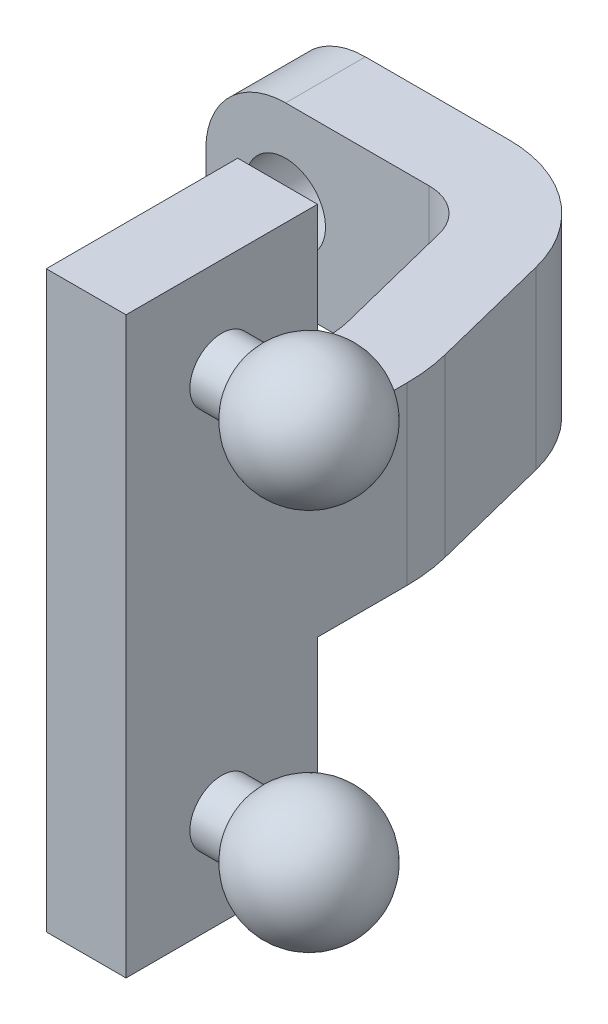
ISO-10303-21;
HEADER;
FILE_DESCRIPTION(('STEP AP214'),'2;1');
FILE_NAME('part.step','',(''),(''),'','','');
FILE_SCHEMA(('AUTOMOTIVE_DESIGN { 1 0 10303 214 1 1 1 1 }'));
ENDSEC;
DATA;
#1=APPLICATION_CONTEXT('core data for automotive mechanical design processes');
#2=APPLICATION_PROTOCOL_DEFINITION('international standard','automotive_design',2000,#1);
#3=PRODUCT_CONTEXT('',#1,'mechanical');
#4=PRODUCT('Part','Part','',(#3));
#5=PRODUCT_RELATED_PRODUCT_CATEGORY('part','',(#4));
#6=PRODUCT_DEFINITION_FORMATION('','',#4);
#7=PRODUCT_DEFINITION_CONTEXT('part definition',#1,'design');
#8=PRODUCT_DEFINITION('design','',#6,#7);
#9=PRODUCT_DEFINITION_SHAPE('','',#8);
#10=(LENGTH_UNIT() NAMED_UNIT(*) SI_UNIT(.MILLI.,.METRE.));
#11=(NAMED_UNIT(*) PLANE_ANGLE_UNIT() SI_UNIT($,.RADIAN.));
#12=(NAMED_UNIT(*) SI_UNIT($,.STERADIAN.) SOLID_ANGLE_UNIT());
#13=UNCERTAINTY_MEASURE_WITH_UNIT(LENGTH_MEASURE(1.E-05),#10,'distance_accuracy_value','');
#14=(GEOMETRIC_REPRESENTATION_CONTEXT(3) GLOBAL_UNCERTAINTY_ASSIGNED_CONTEXT((#13)) GLOBAL_UNIT_ASSIGNED_CONTEXT((#10,
#11,#12)) REPRESENTATION_CONTEXT('',''));
#15=CARTESIAN_POINT('',(0.,0.,0.));
#16=DIRECTION('',(0.,0.,1.));
#17=DIRECTION('',(1.,0.,0.));
#18=AXIS2_PLACEMENT_3D('',#15,#16,#17);
#19=CARTESIAN_POINT('',(0.,2.75,0.));
#20=DIRECTION('',(1.,0.,0.));
#21=DIRECTION('',(0.,0.,-1.));
#22=AXIS2_PLACEMENT_3D('',#19,#20,#21);
#23=PLANE('',#22);
#24=DIRECTION('',(0.,-1.,0.));
#25=VECTOR('',#24,1.);
#26=CARTESIAN_POINT('',(0.,2.75,0.));
#27=LINE('',#26,#25);
#28=CARTESIAN_POINT('',(0.,0.25,0.));
#29=VERTEX_POINT('',#28);
#30=CARTESIAN_POINT('',(0.,-0.25,0.));
#31=VERTEX_POINT('',#30);
#32=EDGE_CURVE('E245',#29,#31,#27,.T.);
#33=ORIENTED_EDGE('',*,*,#32,.T.);
#34=DIRECTION('',(0.,0.,1.));
#35=VECTOR('',#34,1.);
#36=CARTESIAN_POINT('',(0.,-0.25,2.5));
#37=LINE('',#36,#35);
#38=CARTESIAN_POINT('',(0.,-0.25,2.5));
#39=VERTEX_POINT('',#38);
#40=EDGE_CURVE('E296',#31,#39,#37,.T.);
#41=ORIENTED_EDGE('',*,*,#40,.T.);
#42=DIRECTION('',(0.,-1.,0.));
#43=VECTOR('',#42,1.);
#44=CARTESIAN_POINT('',(0.,2.75,2.5));
#45=LINE('',#44,#43);
#46=CARTESIAN_POINT('',(0.,0.25,2.5));
#47=VERTEX_POINT('',#46);
#48=EDGE_CURVE('E291',#47,#39,#45,.T.);
#49=ORIENTED_EDGE('',*,*,#48,.F.);
#50=DIRECTION('',(0.,0.,1.));
#51=VECTOR('',#50,1.);
#52=CARTESIAN_POINT('',(0.,0.25,0.));
#53=LINE('',#52,#51);
#54=EDGE_CURVE('E294',#47,#29,#53,.F.);
#55=ORIENTED_EDGE('',*,*,#54,.T.);
#56=EDGE_LOOP('',(#33,#41,#49,#55));
#57=FACE_BOUND('',#56,.T.);
#58=ADVANCED_FACE('F41',(#57),#23,.F.);
#59=CARTESIAN_POINT('',(0.,2.75,2.5));
#60=DIRECTION('',(0.,0.,-1.));
#61=DIRECTION('',(-1.,0.,0.));
#62=AXIS2_PLACEMENT_3D('',#59,#60,#61);
#63=PLANE('',#62);
#64=CARTESIAN_POINT('',(2.5,0.,2.5));
#65=DIRECTION('',(0.,0.,-1.));
#66=DIRECTION('',(-1.,0.,0.));
#67=AXIS2_PLACEMENT_3D('',#64,#65,#66);
#68=CIRCLE('',#67,1.25);
#69=CARTESIAN_POINT('',(1.25,0.,2.5));
#70=VERTEX_POINT('',#69);
#71=EDGE_CURVE('E220',#70,#70,#68,.T.);
#72=ORIENTED_EDGE('',*,*,#71,.T.);
#73=EDGE_LOOP('',(#72));
#74=FACE_BOUND('',#73,.T.);
#75=ORIENTED_EDGE('',*,*,#48,.T.);
#76=CARTESIAN_POINT('',(2.5,-0.25,2.5));
#77=DIRECTION('',(0.,0.,-1.));
#78=DIRECTION('',(-1.,0.,0.));
#79=AXIS2_PLACEMENT_3D('',#76,#77,#78);
#80=CIRCLE('',#79,2.5);
#81=CARTESIAN_POINT('',(2.5,-2.75,2.5));
#82=VERTEX_POINT('',#81);
#83=EDGE_CURVE('E301',#39,#82,#80,.F.);
#84=ORIENTED_EDGE('',*,*,#83,.T.);
#85=DIRECTION('',(1.,0.,0.));
#86=VECTOR('',#85,1.);
#87=CARTESIAN_POINT('',(0.,-2.75,2.5));
#88=LINE('',#87,#86);
#89=CARTESIAN_POINT('',(7.,-2.75,2.5));
#90=VERTEX_POINT('',#89);
#91=EDGE_CURVE('E223',#82,#90,#88,.T.);
#92=ORIENTED_EDGE('',*,*,#91,.T.);
#93=DIRECTION('',(0.,-1.,0.));
#94=VECTOR('',#93,1.);
#95=CARTESIAN_POINT('',(7.,2.75,2.5));
#96=LINE('',#95,#94);
#97=CARTESIAN_POINT('',(7.,2.75,2.5));
#98=VERTEX_POINT('',#97);
#99=EDGE_CURVE('E288',#98,#90,#96,.T.);
#100=ORIENTED_EDGE('',*,*,#99,.F.);
#101=DIRECTION('',(1.,0.,0.));
#102=VECTOR('',#101,1.);
#103=CARTESIAN_POINT('',(0.,2.75,2.5));
#104=LINE('',#103,#102);
#105=CARTESIAN_POINT('',(2.5,2.75,2.5));
#106=VERTEX_POINT('',#105);
#107=EDGE_CURVE('E224',#106,#98,#104,.T.);
#108=ORIENTED_EDGE('',*,*,#107,.F.);
#109=CARTESIAN_POINT('',(2.5,0.25,2.5));
#110=DIRECTION('',(0.,0.,-1.));
#111=DIRECTION('',(-1.,0.,0.));
#112=AXIS2_PLACEMENT_3D('',#109,#110,#111);
#113=CIRCLE('',#112,2.5);
#114=EDGE_CURVE('E299',#106,#47,#113,.F.);
#115=ORIENTED_EDGE('',*,*,#114,.T.);
#116=EDGE_LOOP('',(#75,#84,#92,#100,#108,#115));
#117=FACE_BOUND('',#116,.T.);
#118=ADVANCED_FACE('F384',(#74,#117),#63,.F.);
#119=CARTESIAN_POINT('',(7.,2.75,4.));
#120=DIRECTION('',(0.,-1.,0.));
#121=DIRECTION('',(0.,0.,-1.));
#122=AXIS2_PLACEMENT_3D('',#119,#120,#121);
#123=CYLINDRICAL_SURFACE('',#122,1.5);
#124=CARTESIAN_POINT('',(7.,-2.75,4.));
#125=DIRECTION('',(0.,-1.,0.));
#126=DIRECTION('',(0.,0.,-1.));
#127=AXIS2_PLACEMENT_3D('',#124,#125,#126);
#128=CIRCLE('',#127,1.5);
#129=CARTESIAN_POINT('',(8.4551584618403,-2.75,3.63597548031131));
#130=VERTEX_POINT('',#129);
#131=EDGE_CURVE('E247',#90,#130,#128,.T.);
#132=ORIENTED_EDGE('',*,*,#131,.T.);
#133=DIRECTION('',(0.,-1.,0.));
#134=VECTOR('',#133,1.);
#135=CARTESIAN_POINT('',(8.4551584618403,2.75,3.63597548031131));
#136=LINE('',#135,#134);
#137=CARTESIAN_POINT('',(8.4551584618403,2.75,3.63597548031131));
#138=VERTEX_POINT('',#137);
#139=EDGE_CURVE('E285',#138,#130,#136,.T.);
#140=ORIENTED_EDGE('',*,*,#139,.F.);
#141=CARTESIAN_POINT('',(7.,2.75,4.));
#142=DIRECTION('',(0.,-1.,0.));
#143=DIRECTION('',(0.,0.,-1.));
#144=AXIS2_PLACEMENT_3D('',#141,#142,#143);
#145=CIRCLE('',#144,1.5);
#146=EDGE_CURVE('E226',#98,#138,#145,.T.);
#147=ORIENTED_EDGE('',*,*,#146,.F.);
#148=ORIENTED_EDGE('',*,*,#99,.T.);
#149=EDGE_LOOP('',(#132,#140,#147,#148));
#150=FACE_BOUND('',#149,.T.);
#151=ADVANCED_FACE('F347',(#150),#123,.F.);
#152=CARTESIAN_POINT('',(8.4551584618403,2.75,3.63597548031131));
#153=DIRECTION('',(0.970105641226864,0.,-0.242683013125794));
#154=DIRECTION('',(-0.242683013125794,0.,-0.970105641226864));
#155=AXIS2_PLACEMENT_3D('',#152,#153,#154);
#156=PLANE('',#155);
#157=DIRECTION('',(0.242683013125794,0.,0.970105641226864));
#158=VECTOR('',#157,1.);
#159=CARTESIAN_POINT('',(8.4551584618403,-2.75,3.63597548031131));
#160=LINE('',#159,#158);
#161=CARTESIAN_POINT('',(9.40654968033646,-2.75,7.43908463158268));
#162=VERTEX_POINT('',#161);
#163=EDGE_CURVE('E249',#130,#162,#160,.T.);
#164=ORIENTED_EDGE('',*,*,#163,.T.);
#165=DIRECTION('',(0.,-1.,0.));
#166=VECTOR('',#165,1.);
#167=CARTESIAN_POINT('',(9.40654968033646,2.75,7.43908463158268));
#168=LINE('',#167,#166);
#169=CARTESIAN_POINT('',(9.40654968033646,2.75,7.43908463158268));
#170=VERTEX_POINT('',#169);
#171=EDGE_CURVE('E282',#170,#162,#168,.T.);
#172=ORIENTED_EDGE('',*,*,#171,.F.);
#173=DIRECTION('',(0.242683013125794,0.,0.970105641226864));
#174=VECTOR('',#173,1.);
#175=CARTESIAN_POINT('',(8.4551584618403,2.75,3.63597548031131));
#176=LINE('',#175,#174);
#177=EDGE_CURVE('E229',#138,#170,#176,.T.);
#178=ORIENTED_EDGE('',*,*,#177,.F.);
#179=ORIENTED_EDGE('',*,*,#139,.T.);
#180=EDGE_LOOP('',(#164,#172,#178,#179));
#181=FACE_BOUND('',#180,.T.);
#182=ADVANCED_FACE('F343',(#181),#156,.F.);
#183=CARTESIAN_POINT('',(6.37398146343561,2.75,8.19771622912322));
#184=DIRECTION('',(0.,-1.,0.));
#185=DIRECTION('',(0.,0.,-1.));
#186=AXIS2_PLACEMENT_3D('',#183,#184,#185);
#187=CYLINDRICAL_SURFACE('',#186,3.12601853656438);
#188=CARTESIAN_POINT('',(6.37398146343561,-2.75,8.19771622912322));
#189=DIRECTION('',(0.,-1.,0.));
#190=DIRECTION('',(0.,0.,1.));
#191=AXIS2_PLACEMENT_3D('',#188,#189,#190);
#192=CIRCLE('',#191,3.12601853656438);
#193=CARTESIAN_POINT('',(9.50000000000001,-2.75,8.19771622912322));
#194=VERTEX_POINT('',#193);
#195=EDGE_CURVE('E251',#162,#194,#192,.T.);
#196=ORIENTED_EDGE('',*,*,#195,.T.);
#197=DIRECTION('',(0.,-1.,0.));
#198=VECTOR('',#197,1.);
#199=CARTESIAN_POINT('',(9.50000000000001,2.75,8.19771622912322));
#200=LINE('',#199,#198);
#201=CARTESIAN_POINT('',(9.50000000000001,2.75,8.19771622912322));
#202=VERTEX_POINT('',#201);
#203=EDGE_CURVE('E179',#202,#194,#200,.T.);
#204=ORIENTED_EDGE('',*,*,#203,.F.);
#205=CARTESIAN_POINT('',(6.37398146343561,2.75,8.19771622912322));
#206=DIRECTION('',(0.,-1.,0.));
#207=DIRECTION('',(0.,0.,1.));
#208=AXIS2_PLACEMENT_3D('',#205,#206,#207);
#209=CIRCLE('',#208,3.12601853656438);
#210=EDGE_CURVE('E231',#170,#202,#209,.T.);
#211=ORIENTED_EDGE('',*,*,#210,.F.);
#212=ORIENTED_EDGE('',*,*,#171,.T.);
#213=EDGE_LOOP('',(#196,#204,#211,#212));
#214=FACE_BOUND('',#213,.T.);
#215=ADVANCED_FACE('F339',(#214),#187,.F.);
#216=CARTESIAN_POINT('',(9.50000000000001,2.75,8.19771622912322));
#217=DIRECTION('',(1.,0.,0.));
#218=DIRECTION('',(0.,0.,-1.));
#219=AXIS2_PLACEMENT_3D('',#216,#217,#218);
#220=PLANE('',#219);
#221=DIRECTION('',(0.,0.,1.));
#222=VECTOR('',#221,1.);
#223=CARTESIAN_POINT('',(9.50000000000001,-2.75,8.19771622912322));
#224=LINE('',#223,#222);
#225=CARTESIAN_POINT('',(9.50000000000002,-2.75,11.));
#226=VERTEX_POINT('',#225);
#227=EDGE_CURVE('E253',#194,#226,#224,.T.);
#228=ORIENTED_EDGE('',*,*,#227,.T.);
#229=DIRECTION('',(0.,-1.,0.));
#230=VECTOR('',#229,1.);
#231=CARTESIAN_POINT('',(9.50000000000002,8.99999999999999,11.));
#232=LINE('',#231,#230);
#233=CARTESIAN_POINT('',(9.50000000000002,-9.,11.));
#234=VERTEX_POINT('',#233);
#235=EDGE_CURVE('E193',#226,#234,#232,.T.);
#236=ORIENTED_EDGE('',*,*,#235,.T.);
#237=DIRECTION('',(0.,0.,1.));
#238=VECTOR('',#237,1.);
#239=CARTESIAN_POINT('',(9.50000000000002,-9.,11.));
#240=LINE('',#239,#238);
#241=CARTESIAN_POINT('',(9.50000000000002,-9.,17.));
#242=VERTEX_POINT('',#241);
#243=EDGE_CURVE('E175',#234,#242,#240,.T.);
#244=ORIENTED_EDGE('',*,*,#243,.T.);
#245=DIRECTION('',(0.,-1.,0.));
#246=VECTOR('',#245,1.);
#247=CARTESIAN_POINT('',(9.5,2.75,17.));
#248=LINE('',#247,#246);
#249=CARTESIAN_POINT('',(9.50000000000002,9.,17.));
#250=VERTEX_POINT('',#249);
#251=EDGE_CURVE('E167',#250,#242,#248,.T.);
#252=ORIENTED_EDGE('',*,*,#251,.F.);
#253=DIRECTION('',(0.,0.,-1.));
#254=VECTOR('',#253,1.);
#255=CARTESIAN_POINT('',(9.50000000000002,8.99999999999999,11.));
#256=LINE('',#255,#254);
#257=CARTESIAN_POINT('',(9.50000000000002,8.99999999999999,11.));
#258=VERTEX_POINT('',#257);
#259=EDGE_CURVE('E173',#250,#258,#256,.T.);
#260=ORIENTED_EDGE('',*,*,#259,.T.);
#261=CARTESIAN_POINT('',(9.50000000000001,2.75,11.));
#262=VERTEX_POINT('',#261);
#263=EDGE_CURVE('E196',#258,#262,#232,.T.);
#264=ORIENTED_EDGE('',*,*,#263,.T.);
#265=DIRECTION('',(0.,0.,1.));
#266=VECTOR('',#265,1.);
#267=CARTESIAN_POINT('',(9.50000000000001,2.75,8.19771622912322));
#268=LINE('',#267,#266);
#269=EDGE_CURVE('E56',#202,#262,#268,.T.);
#270=ORIENTED_EDGE('',*,*,#269,.F.);
#271=ORIENTED_EDGE('',*,*,#203,.T.);
#272=EDGE_LOOP('',(#228,#236,#244,#252,#260,#264,#270,#271));
#273=FACE_BOUND('',#272,.T.);
#274=ADVANCED_FACE('F170',(#273),#220,.F.);
#275=CARTESIAN_POINT('',(9.5,2.75,17.));
#276=DIRECTION('',(0.,0.,-1.));
#277=DIRECTION('',(-1.,0.,0.));
#278=AXIS2_PLACEMENT_3D('',#275,#276,#277);
#279=PLANE('',#278);
#280=ORIENTED_EDGE('',*,*,#251,.T.);
#281=DIRECTION('',(-1.,0.,0.));
#282=VECTOR('',#281,1.);
#283=CARTESIAN_POINT('',(30.9736659610103,-9.,17.));
#284=LINE('',#283,#282);
#285=CARTESIAN_POINT('',(12.,-9.,17.));
#286=VERTEX_POINT('',#285);
#287=EDGE_CURVE('E206',#286,#242,#284,.T.);
#288=ORIENTED_EDGE('',*,*,#287,.F.);
#289=DIRECTION('',(0.,-1.,0.));
#290=VECTOR('',#289,1.);
#291=CARTESIAN_POINT('',(12.,2.75,17.));
#292=LINE('',#291,#290);
#293=CARTESIAN_POINT('',(12.,9.,17.));
#294=VERTEX_POINT('',#293);
#295=EDGE_CURVE('E180',#294,#286,#292,.T.);
#296=ORIENTED_EDGE('',*,*,#295,.F.);
#297=DIRECTION('',(-1.,0.,0.));
#298=VECTOR('',#297,1.);
#299=CARTESIAN_POINT('',(30.9736659610103,9.,17.));
#300=LINE('',#299,#298);
#301=EDGE_CURVE('E183',#294,#250,#300,.T.);
#302=ORIENTED_EDGE('',*,*,#301,.T.);
#303=EDGE_LOOP('',(#280,#288,#296,#302));
#304=FACE_BOUND('',#303,.T.);
#305=ADVANCED_FACE('F184',(#304),#279,.F.);
#306=CARTESIAN_POINT('',(12.,2.75,8.19771622912322));
#307=DIRECTION('',(-1.,0.,0.));
#308=DIRECTION('',(0.,0.,1.));
#309=AXIS2_PLACEMENT_3D('',#306,#307,#308);
#310=PLANE('',#309);
#311=CARTESIAN_POINT('',(12.,-5.99999999999999,14.));
#312=DIRECTION('',(-1.,0.,0.));
#313=DIRECTION('',(0.,0.,-1.));
#314=AXIS2_PLACEMENT_3D('',#311,#312,#313);
#315=CIRCLE('',#314,1.);
#316=CARTESIAN_POINT('',(12.,-5.99999999999999,13.));
#317=VERTEX_POINT('',#316);
#318=EDGE_CURVE('E199',#317,#317,#315,.T.);
#319=ORIENTED_EDGE('',*,*,#318,.T.);
#320=EDGE_LOOP('',(#319));
#321=FACE_BOUND('',#320,.T.);
#322=CARTESIAN_POINT('',(12.,5.99999999999999,14.));
#323=DIRECTION('',(-1.,0.,0.));
#324=DIRECTION('',(0.,0.,1.));
#325=AXIS2_PLACEMENT_3D('',#322,#323,#324);
#326=CIRCLE('',#325,1.);
#327=CARTESIAN_POINT('',(12.,5.99999999999999,15.));
#328=VERTEX_POINT('',#327);
#329=EDGE_CURVE('E11',#328,#328,#326,.F.);
#330=ORIENTED_EDGE('',*,*,#329,.F.);
#331=EDGE_LOOP('',(#330));
#332=FACE_BOUND('',#331,.T.);
#333=DIRECTION('',(0.,0.,-1.));
#334=VECTOR('',#333,1.);
#335=CARTESIAN_POINT('',(12.,2.75,8.19771622912322));
#336=LINE('',#335,#334);
#337=CARTESIAN_POINT('',(12.,2.75,11.));
#338=VERTEX_POINT('',#337);
#339=CARTESIAN_POINT('',(12.,2.75,8.19771622912322));
#340=VERTEX_POINT('',#339);
#341=EDGE_CURVE('E234',#338,#340,#336,.T.);
#342=ORIENTED_EDGE('',*,*,#341,.F.);
#343=DIRECTION('',(0.,1.,0.));
#344=VECTOR('',#343,1.);
#345=CARTESIAN_POINT('',(12.,8.99999999999999,11.));
#346=LINE('',#345,#344);
#347=CARTESIAN_POINT('',(12.,8.99999999999999,11.));
#348=VERTEX_POINT('',#347);
#349=EDGE_CURVE('E208',#338,#348,#346,.T.);
#350=ORIENTED_EDGE('',*,*,#349,.T.);
#351=DIRECTION('',(0.,0.,1.));
#352=VECTOR('',#351,1.);
#353=CARTESIAN_POINT('',(12.,8.99999999999999,11.));
#354=LINE('',#353,#352);
#355=EDGE_CURVE('E213',#348,#294,#354,.T.);
#356=ORIENTED_EDGE('',*,*,#355,.T.);
#357=ORIENTED_EDGE('',*,*,#295,.T.);
#358=DIRECTION('',(0.,0.,-1.));
#359=VECTOR('',#358,1.);
#360=CARTESIAN_POINT('',(12.,-9.,11.));
#361=LINE('',#360,#359);
#362=CARTESIAN_POINT('',(12.,-9.,11.));
#363=VERTEX_POINT('',#362);
#364=EDGE_CURVE('E202',#286,#363,#361,.T.);
#365=ORIENTED_EDGE('',*,*,#364,.T.);
#366=CARTESIAN_POINT('',(12.,-2.75,11.));
#367=VERTEX_POINT('',#366);
#368=EDGE_CURVE('E64',#363,#367,#346,.T.);
#369=ORIENTED_EDGE('',*,*,#368,.T.);
#370=DIRECTION('',(0.,0.,-1.));
#371=VECTOR('',#370,1.);
#372=CARTESIAN_POINT('',(12.,-2.75,8.19771622912322));
#373=LINE('',#372,#371);
#374=CARTESIAN_POINT('',(12.,-2.75,8.19771622912322));
#375=VERTEX_POINT('',#374);
#376=EDGE_CURVE('E255',#367,#375,#373,.T.);
#377=ORIENTED_EDGE('',*,*,#376,.T.);
#378=DIRECTION('',(0.,-1.,0.));
#379=VECTOR('',#378,1.);
#380=CARTESIAN_POINT('',(12.,2.75,8.19771622912322));
#381=LINE('',#380,#379);
#382=EDGE_CURVE('E276',#340,#375,#381,.T.);
#383=ORIENTED_EDGE('',*,*,#382,.F.);
#384=EDGE_LOOP('',(#342,#350,#356,#357,#365,#369,#377,#383));
#385=FACE_BOUND('',#384,.T.);
#386=ADVANCED_FACE('F322',(#321,#332,#385),#310,.F.);
#387=CARTESIAN_POINT('',(6.37398146343561,2.75,8.19771622912322));
#388=DIRECTION('',(0.,-1.,0.));
#389=DIRECTION('',(0.,0.,-1.));
#390=AXIS2_PLACEMENT_3D('',#387,#388,#389);
#391=CYLINDRICAL_SURFACE('',#390,5.62601853656438);
#392=CARTESIAN_POINT('',(6.37398146343561,-2.75,8.19771622912322));
#393=DIRECTION('',(0.,1.,0.));
#394=DIRECTION('',(0.,0.,-1.));
#395=AXIS2_PLACEMENT_3D('',#392,#393,#394);
#396=CIRCLE('',#395,5.62601853656438);
#397=CARTESIAN_POINT('',(11.8318137834036,-2.75,6.8323770987682));
#398=VERTEX_POINT('',#397);
#399=EDGE_CURVE('E257',#375,#398,#396,.T.);
#400=ORIENTED_EDGE('',*,*,#399,.T.);
#401=DIRECTION('',(0.,-1.,0.));
#402=VECTOR('',#401,1.);
#403=CARTESIAN_POINT('',(11.8318137834036,2.75,6.8323770987682));
#404=LINE('',#403,#402);
#405=CARTESIAN_POINT('',(11.8318137834036,2.75,6.8323770987682));
#406=VERTEX_POINT('',#405);
#407=EDGE_CURVE('E273',#406,#398,#404,.T.);
#408=ORIENTED_EDGE('',*,*,#407,.F.);
#409=CARTESIAN_POINT('',(6.37398146343561,2.75,8.19771622912322));
#410=DIRECTION('',(0.,1.,0.));
#411=DIRECTION('',(0.,0.,-1.));
#412=AXIS2_PLACEMENT_3D('',#409,#410,#411);
#413=CIRCLE('',#412,5.62601853656438);
#414=EDGE_CURVE('E236',#340,#406,#413,.T.);
#415=ORIENTED_EDGE('',*,*,#414,.F.);
#416=ORIENTED_EDGE('',*,*,#382,.T.);
#417=EDGE_LOOP('',(#400,#408,#415,#416));
#418=FACE_BOUND('',#417,.T.);
#419=ADVANCED_FACE('F325',(#418),#391,.T.);
#420=CARTESIAN_POINT('',(10.8804225649075,2.75,3.02926794749682));
#421=DIRECTION('',(-0.970105641226864,0.,0.242683013125794));
#422=DIRECTION('',(0.242683013125794,0.,0.970105641226864));
#423=AXIS2_PLACEMENT_3D('',#420,#421,#422);
#424=PLANE('',#423);
#425=DIRECTION('',(-0.242683013125794,0.,-0.970105641226864));
#426=VECTOR('',#425,1.);
#427=CARTESIAN_POINT('',(10.8804225649075,-2.75,3.02926794749682));
#428=LINE('',#427,#426);
#429=CARTESIAN_POINT('',(10.8804225649075,-2.75,3.02926794749682));
#430=VERTEX_POINT('',#429);
#431=EDGE_CURVE('E259',#398,#430,#428,.T.);
#432=ORIENTED_EDGE('',*,*,#431,.T.);
#433=DIRECTION('',(0.,-1.,0.));
#434=VECTOR('',#433,1.);
#435=CARTESIAN_POINT('',(10.8804225649075,2.75,3.02926794749682));
#436=LINE('',#435,#434);
#437=CARTESIAN_POINT('',(10.8804225649075,2.75,3.02926794749682));
#438=VERTEX_POINT('',#437);
#439=EDGE_CURVE('E270',#438,#430,#436,.T.);
#440=ORIENTED_EDGE('',*,*,#439,.F.);
#441=DIRECTION('',(-0.242683013125794,0.,-0.970105641226864));
#442=VECTOR('',#441,1.);
#443=CARTESIAN_POINT('',(10.8804225649075,2.75,3.02926794749682));
#444=LINE('',#443,#442);
#445=EDGE_CURVE('E238',#406,#438,#444,.T.);
#446=ORIENTED_EDGE('',*,*,#445,.F.);
#447=ORIENTED_EDGE('',*,*,#407,.T.);
#448=EDGE_LOOP('',(#432,#440,#446,#447));
#449=FACE_BOUND('',#448,.T.);
#450=ADVANCED_FACE('F374',(#449),#424,.F.);
#451=CARTESIAN_POINT('',(7.,2.75,4.));
#452=DIRECTION('',(0.,-1.,0.));
#453=DIRECTION('',(0.,0.,-1.));
#454=AXIS2_PLACEMENT_3D('',#451,#452,#453);
#455=CYLINDRICAL_SURFACE('',#454,4.);
#456=CARTESIAN_POINT('',(7.,-2.75,4.));
#457=DIRECTION('',(0.,1.,0.));
#458=DIRECTION('',(0.,0.,-1.));
#459=AXIS2_PLACEMENT_3D('',#456,#457,#458);
#460=CIRCLE('',#459,4.);
#461=CARTESIAN_POINT('',(7.,-2.75,0.));
#462=VERTEX_POINT('',#461);
#463=EDGE_CURVE('E261',#430,#462,#460,.T.);
#464=ORIENTED_EDGE('',*,*,#463,.T.);
#465=DIRECTION('',(0.,-1.,0.));
#466=VECTOR('',#465,1.);
#467=CARTESIAN_POINT('',(7.,2.75,0.));
#468=LINE('',#467,#466);
#469=CARTESIAN_POINT('',(7.,2.75,0.));
#470=VERTEX_POINT('',#469);
#471=EDGE_CURVE('E267',#470,#462,#468,.T.);
#472=ORIENTED_EDGE('',*,*,#471,.F.);
#473=CARTESIAN_POINT('',(7.,2.75,4.));
#474=DIRECTION('',(0.,1.,0.));
#475=DIRECTION('',(0.,0.,-1.));
#476=AXIS2_PLACEMENT_3D('',#473,#474,#475);
#477=CIRCLE('',#476,4.);
#478=EDGE_CURVE('E240',#438,#470,#477,.T.);
#479=ORIENTED_EDGE('',*,*,#478,.F.);
#480=ORIENTED_EDGE('',*,*,#439,.T.);
#481=EDGE_LOOP('',(#464,#472,#479,#480));
#482=FACE_BOUND('',#481,.T.);
#483=ADVANCED_FACE('F371',(#482),#455,.T.);
#484=CARTESIAN_POINT('',(0.,2.75,0.));
#485=DIRECTION('',(0.,0.,1.));
#486=DIRECTION('',(1.,0.,0.));
#487=AXIS2_PLACEMENT_3D('',#484,#485,#486);
#488=PLANE('',#487);
#489=CARTESIAN_POINT('',(2.5,0.,0.));
#490=DIRECTION('',(0.,0.,-1.));
#491=DIRECTION('',(-1.,0.,0.));
#492=AXIS2_PLACEMENT_3D('',#489,#490,#491);
#493=CIRCLE('',#492,1.25);
#494=CARTESIAN_POINT('',(1.25,0.,0.));
#495=VERTEX_POINT('',#494);
#496=EDGE_CURVE('E217',#495,#495,#493,.T.);
#497=ORIENTED_EDGE('',*,*,#496,.F.);
#498=EDGE_LOOP('',(#497));
#499=FACE_BOUND('',#498,.T.);
#500=DIRECTION('',(-1.,0.,0.));
#501=VECTOR('',#500,1.);
#502=CARTESIAN_POINT('',(0.,-2.75,0.));
#503=LINE('',#502,#501);
#504=CARTESIAN_POINT('',(2.5,-2.75,0.));
#505=VERTEX_POINT('',#504);
#506=EDGE_CURVE('E227',#462,#505,#503,.T.);
#507=ORIENTED_EDGE('',*,*,#506,.T.);
#508=CARTESIAN_POINT('',(2.5,-0.25,0.));
#509=DIRECTION('',(0.,0.,1.));
#510=DIRECTION('',(1.,0.,0.));
#511=AXIS2_PLACEMENT_3D('',#508,#509,#510);
#512=CIRCLE('',#511,2.5);
#513=EDGE_CURVE('E307',#505,#31,#512,.F.);
#514=ORIENTED_EDGE('',*,*,#513,.T.);
#515=ORIENTED_EDGE('',*,*,#32,.F.);
#516=CARTESIAN_POINT('',(2.5,0.25,0.));
#517=DIRECTION('',(0.,0.,1.));
#518=DIRECTION('',(1.,0.,0.));
#519=AXIS2_PLACEMENT_3D('',#516,#517,#518);
#520=CIRCLE('',#519,2.5);
#521=CARTESIAN_POINT('',(2.5,2.75,0.));
#522=VERTEX_POINT('',#521);
#523=EDGE_CURVE('E305',#29,#522,#520,.F.);
#524=ORIENTED_EDGE('',*,*,#523,.T.);
#525=DIRECTION('',(-1.,0.,0.));
#526=VECTOR('',#525,1.);
#527=CARTESIAN_POINT('',(0.,2.75,0.));
#528=LINE('',#527,#526);
#529=EDGE_CURVE('E242',#470,#522,#528,.T.);
#530=ORIENTED_EDGE('',*,*,#529,.F.);
#531=ORIENTED_EDGE('',*,*,#471,.T.);
#532=EDGE_LOOP('',(#507,#514,#515,#524,#530,#531));
#533=FACE_BOUND('',#532,.T.);
#534=ADVANCED_FACE('F359',(#499,#533),#488,.F.);
#535=CARTESIAN_POINT('',(7.,2.75,4.));
#536=DIRECTION('',(0.,-1.,0.));
#537=DIRECTION('',(0.,0.,-1.));
#538=AXIS2_PLACEMENT_3D('',#535,#536,#537);
#539=PLANE('',#538);
#540=ORIENTED_EDGE('',*,*,#269,.T.);
#541=DIRECTION('',(1.,0.,0.));
#542=VECTOR('',#541,1.);
#543=CARTESIAN_POINT('',(7.,2.75,11.));
#544=LINE('',#543,#542);
#545=EDGE_CURVE('E215',#262,#338,#544,.T.);
#546=ORIENTED_EDGE('',*,*,#545,.T.);
#547=ORIENTED_EDGE('',*,*,#341,.T.);
#548=ORIENTED_EDGE('',*,*,#414,.T.);
#549=ORIENTED_EDGE('',*,*,#445,.T.);
#550=ORIENTED_EDGE('',*,*,#478,.T.);
#551=ORIENTED_EDGE('',*,*,#529,.T.);
#552=DIRECTION('',(0.,0.,1.));
#553=VECTOR('',#552,1.);
#554=CARTESIAN_POINT('',(2.5,2.75,4.));
#555=LINE('',#554,#553);
#556=EDGE_CURVE('E309',#522,#106,#555,.T.);
#557=ORIENTED_EDGE('',*,*,#556,.T.);
#558=ORIENTED_EDGE('',*,*,#107,.T.);
#559=ORIENTED_EDGE('',*,*,#146,.T.);
#560=ORIENTED_EDGE('',*,*,#177,.T.);
#561=ORIENTED_EDGE('',*,*,#210,.T.);
#562=EDGE_LOOP('',(#540,#546,#547,#548,#549,#550,#551,#557,#558,#559,#560,#561));
#563=FACE_BOUND('',#562,.T.);
#564=ADVANCED_FACE('F328',(#563),#539,.F.);
#565=CARTESIAN_POINT('',(7.,-2.75,4.));
#566=DIRECTION('',(0.,-1.,0.));
#567=DIRECTION('',(0.,0.,-1.));
#568=AXIS2_PLACEMENT_3D('',#565,#566,#567);
#569=PLANE('',#568);
#570=DIRECTION('',(1.,0.,0.));
#571=VECTOR('',#570,1.);
#572=CARTESIAN_POINT('',(7.,-2.75,11.));
#573=LINE('',#572,#571);
#574=EDGE_CURVE('E49',#226,#367,#573,.T.);
#575=ORIENTED_EDGE('',*,*,#574,.F.);
#576=ORIENTED_EDGE('',*,*,#227,.F.);
#577=ORIENTED_EDGE('',*,*,#195,.F.);
#578=ORIENTED_EDGE('',*,*,#163,.F.);
#579=ORIENTED_EDGE('',*,*,#131,.F.);
#580=ORIENTED_EDGE('',*,*,#91,.F.);
#581=DIRECTION('',(0.,0.,1.));
#582=VECTOR('',#581,1.);
#583=CARTESIAN_POINT('',(2.5,-2.75,0.));
#584=LINE('',#583,#582);
#585=EDGE_CURVE('E303',#82,#505,#584,.F.);
#586=ORIENTED_EDGE('',*,*,#585,.T.);
#587=ORIENTED_EDGE('',*,*,#506,.F.);
#588=ORIENTED_EDGE('',*,*,#463,.F.);
#589=ORIENTED_EDGE('',*,*,#431,.F.);
#590=ORIENTED_EDGE('',*,*,#399,.F.);
#591=ORIENTED_EDGE('',*,*,#376,.F.);
#592=EDGE_LOOP('',(#575,#576,#577,#578,#579,#580,#586,#587,#588,#589,#590,#591));
#593=FACE_BOUND('',#592,.T.);
#594=ADVANCED_FACE('F319',(#593),#569,.T.);
#595=CARTESIAN_POINT('',(2.5,0.,10.));
#596=DIRECTION('',(0.,0.,-1.));
#597=DIRECTION('',(-1.,0.,0.));
#598=AXIS2_PLACEMENT_3D('',#595,#596,#597);
#599=CYLINDRICAL_SURFACE('',#598,1.25);
#600=ORIENTED_EDGE('',*,*,#496,.T.);
#601=EDGE_LOOP('',(#600));
#602=FACE_BOUND('',#601,.T.);
#603=ORIENTED_EDGE('',*,*,#71,.F.);
#604=EDGE_LOOP('',(#603));
#605=FACE_BOUND('',#604,.T.);
#606=ADVANCED_FACE('F394',(#602,#605),#599,.F.);
#607=CARTESIAN_POINT('',(2.5,-0.25,0.));
#608=DIRECTION('',(0.,0.,-1.));
#609=DIRECTION('',(-1.,0.,0.));
#610=AXIS2_PLACEMENT_3D('',#607,#608,#609);
#611=CYLINDRICAL_SURFACE('',#610,2.5);
#612=ORIENTED_EDGE('',*,*,#513,.F.);
#613=ORIENTED_EDGE('',*,*,#585,.F.);
#614=ORIENTED_EDGE('',*,*,#83,.F.);
#615=ORIENTED_EDGE('',*,*,#40,.F.);
#616=EDGE_LOOP('',(#612,#613,#614,#615));
#617=FACE_BOUND('',#616,.T.);
#618=ADVANCED_FACE('F355',(#617),#611,.T.);
#619=CARTESIAN_POINT('',(2.5,0.25,4.));
#620=DIRECTION('',(0.,0.,1.));
#621=DIRECTION('',(1.,0.,0.));
#622=AXIS2_PLACEMENT_3D('',#619,#620,#621);
#623=CYLINDRICAL_SURFACE('',#622,2.5);
#624=ORIENTED_EDGE('',*,*,#523,.F.);
#625=ORIENTED_EDGE('',*,*,#54,.F.);
#626=ORIENTED_EDGE('',*,*,#114,.F.);
#627=ORIENTED_EDGE('',*,*,#556,.F.);
#628=EDGE_LOOP('',(#624,#625,#626,#627));
#629=FACE_BOUND('',#628,.T.);
#630=ADVANCED_FACE('F43',(#629),#623,.T.);
#631=CARTESIAN_POINT('',(30.9736659610103,-9.,11.));
#632=DIRECTION('',(0.,-1.,0.));
#633=DIRECTION('',(0.,0.,-1.));
#634=AXIS2_PLACEMENT_3D('',#631,#632,#633);
#635=PLANE('',#634);
#636=ORIENTED_EDGE('',*,*,#364,.F.);
#637=ORIENTED_EDGE('',*,*,#287,.T.);
#638=ORIENTED_EDGE('',*,*,#243,.F.);
#639=DIRECTION('',(-1.,0.,0.));
#640=VECTOR('',#639,1.);
#641=CARTESIAN_POINT('',(30.9736659610103,-9.,11.));
#642=LINE('',#641,#640);
#643=EDGE_CURVE('E209',#363,#234,#642,.T.);
#644=ORIENTED_EDGE('',*,*,#643,.F.);
#645=EDGE_LOOP('',(#636,#637,#638,#644));
#646=FACE_BOUND('',#645,.T.);
#647=ADVANCED_FACE('F399',(#646),#635,.T.);
#648=CARTESIAN_POINT('',(30.9736659610103,8.99999999999999,11.));
#649=DIRECTION('',(0.,0.,-1.));
#650=DIRECTION('',(-1.,0.,0.));
#651=AXIS2_PLACEMENT_3D('',#648,#649,#650);
#652=PLANE('',#651);
#653=ORIENTED_EDGE('',*,*,#235,.F.);
#654=ORIENTED_EDGE('',*,*,#574,.T.);
#655=ORIENTED_EDGE('',*,*,#368,.F.);
#656=ORIENTED_EDGE('',*,*,#643,.T.);
#657=EDGE_LOOP('',(#653,#654,#655,#656));
#658=FACE_BOUND('',#657,.T.);
#659=ADVANCED_FACE('F314',(#658),#652,.T.);
#660=ORIENTED_EDGE('',*,*,#545,.F.);
#661=ORIENTED_EDGE('',*,*,#263,.F.);
#662=DIRECTION('',(-1.,0.,0.));
#663=VECTOR('',#662,1.);
#664=CARTESIAN_POINT('',(30.9736659610103,8.99999999999999,11.));
#665=LINE('',#664,#663);
#666=EDGE_CURVE('E188',#348,#258,#665,.T.);
#667=ORIENTED_EDGE('',*,*,#666,.F.);
#668=ORIENTED_EDGE('',*,*,#349,.F.);
#669=EDGE_LOOP('',(#660,#661,#667,#668));
#670=FACE_BOUND('',#669,.T.);
#671=ADVANCED_FACE('F332',(#670),#652,.T.);
#672=CARTESIAN_POINT('',(30.9736659610103,8.99999999999999,11.));
#673=DIRECTION('',(0.,1.,0.));
#674=DIRECTION('',(0.,0.,1.));
#675=AXIS2_PLACEMENT_3D('',#672,#673,#674);
#676=PLANE('',#675);
#677=ORIENTED_EDGE('',*,*,#355,.F.);
#678=ORIENTED_EDGE('',*,*,#666,.T.);
#679=ORIENTED_EDGE('',*,*,#259,.F.);
#680=ORIENTED_EDGE('',*,*,#301,.F.);
#681=EDGE_LOOP('',(#677,#678,#679,#680));
#682=FACE_BOUND('',#681,.T.);
#683=ADVANCED_FACE('F190',(#682),#676,.T.);
#684=CARTESIAN_POINT('',(13.,5.99999999999999,14.));
#685=DIRECTION('',(-1.,0.,0.));
#686=DIRECTION('',(0.,0.,1.));
#687=AXIS2_PLACEMENT_3D('',#684,#685,#686);
#688=CYLINDRICAL_SURFACE('',#687,1.);
#689=CARTESIAN_POINT('',(13.,5.99999999999999,14.));
#690=DIRECTION('',(1.,0.,0.));
#691=DIRECTION('',(0.,0.,-1.));
#692=AXIS2_PLACEMENT_3D('',#689,#690,#691);
#693=CIRCLE('',#692,1.);
#694=CARTESIAN_POINT('',(13.,5.99999999999999,13.));
#695=VERTEX_POINT('',#694);
#696=EDGE_CURVE('E194',#695,#695,#693,.T.);
#697=ORIENTED_EDGE('',*,*,#696,.F.);
#698=EDGE_LOOP('',(#697));
#699=FACE_BOUND('',#698,.T.);
#700=ORIENTED_EDGE('',*,*,#329,.T.);
#701=EDGE_LOOP('',(#700));
#702=FACE_BOUND('',#701,.T.);
#703=ADVANCED_FACE('F547',(#699,#702),#688,.T.);
#704=CARTESIAN_POINT('',(14.7320508075689,5.99999999999999,14.));
#705=DIRECTION('',(-1.,0.,0.));
#706=DIRECTION('',(0.,1.,0.));
#707=AXIS2_PLACEMENT_3D('',#704,#705,#706);
#708=SPHERICAL_SURFACE('',#707,2.);
#709=ORIENTED_EDGE('',*,*,#696,.T.);
#710=EDGE_LOOP('',(#709));
#711=FACE_BOUND('',#710,.T.);
#712=ADVANCED_FACE('F554',(#711),#708,.T.);
#713=CARTESIAN_POINT('',(13.,-5.99999999999999,14.));
#714=DIRECTION('',(-1.,0.,0.));
#715=DIRECTION('',(0.,0.,1.));
#716=AXIS2_PLACEMENT_3D('',#713,#714,#715);
#717=CYLINDRICAL_SURFACE('',#716,1.);
#718=CARTESIAN_POINT('',(13.,-5.99999999999999,14.));
#719=DIRECTION('',(1.,0.,0.));
#720=DIRECTION('',(0.,1.,0.));
#721=AXIS2_PLACEMENT_3D('',#718,#719,#720);
#722=CIRCLE('',#721,1.);
#723=CARTESIAN_POINT('',(13.,-4.99999999999999,14.));
#724=VERTEX_POINT('',#723);
#725=EDGE_CURVE('E600',#724,#724,#722,.T.);
#726=ORIENTED_EDGE('',*,*,#725,.F.);
#727=EDGE_LOOP('',(#726));
#728=FACE_BOUND('',#727,.T.);
#729=ORIENTED_EDGE('',*,*,#318,.F.);
#730=EDGE_LOOP('',(#729));
#731=FACE_BOUND('',#730,.T.);
#732=ADVANCED_FACE('F563',(#728,#731),#717,.T.);
#733=CARTESIAN_POINT('',(14.7320508075689,-5.99999999999999,14.));
#734=DIRECTION('',(-1.,0.,0.));
#735=DIRECTION('',(0.,-1.,0.));
#736=AXIS2_PLACEMENT_3D('',#733,#734,#735);
#737=SPHERICAL_SURFACE('',#736,2.);
#738=ORIENTED_EDGE('',*,*,#725,.T.);
#739=EDGE_LOOP('',(#738));
#740=FACE_BOUND('',#739,.T.);
#741=ADVANCED_FACE('F572',(#740),#737,.T.);
#742=CLOSED_SHELL('',(#58,#118,#151,#182,#215,#274,#305,#386,#419,#450,#483,#534,#564,#594,#606,
#618,#630,#647,#659,#671,#683,#703,#712,#732,#741));
#743=MANIFOLD_SOLID_BREP('B2',#742);
#744=ADVANCED_BREP_SHAPE_REPRESENTATION('',(#18,#743),#14);
#745=SHAPE_DEFINITION_REPRESENTATION(#9,#744);
ENDSEC;
END-ISO-10303-21;
